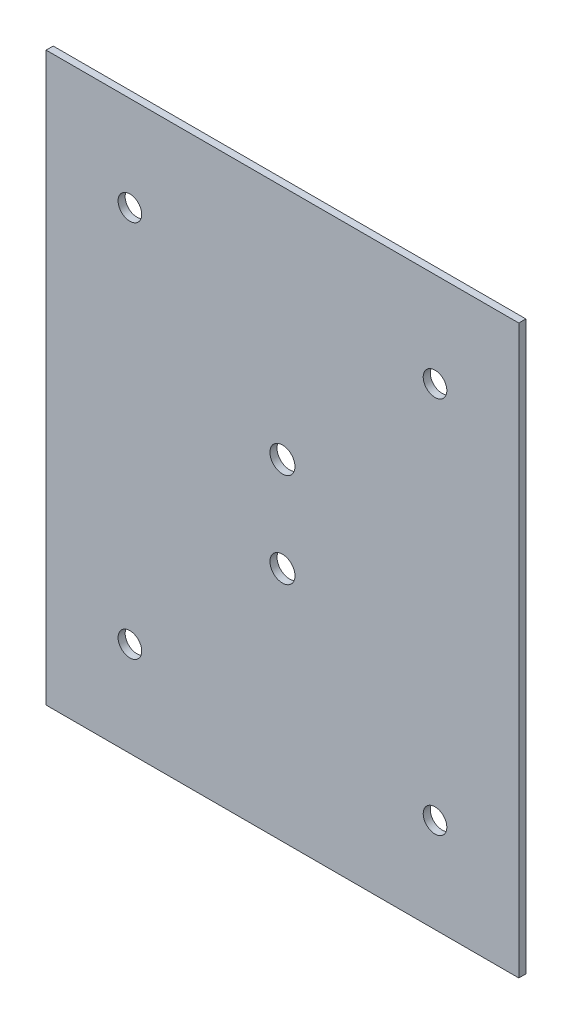
ISO-10303-21;
HEADER;
FILE_DESCRIPTION(('STEP AP214'),'2;1');
FILE_NAME('part.step','',(''),(''),'','','');
FILE_SCHEMA(('AUTOMOTIVE_DESIGN { 1 0 10303 214 1 1 1 1 }'));
ENDSEC;
DATA;
#1=APPLICATION_CONTEXT('core data for automotive mechanical design processes');
#2=APPLICATION_PROTOCOL_DEFINITION('international standard','automotive_design',2000,#1);
#3=PRODUCT_CONTEXT('',#1,'mechanical');
#4=PRODUCT('Part','Part','',(#3));
#5=PRODUCT_RELATED_PRODUCT_CATEGORY('part','',(#4));
#6=PRODUCT_DEFINITION_FORMATION('','',#4);
#7=PRODUCT_DEFINITION_CONTEXT('part definition',#1,'design');
#8=PRODUCT_DEFINITION('design','',#6,#7);
#9=PRODUCT_DEFINITION_SHAPE('','',#8);
#10=(LENGTH_UNIT() NAMED_UNIT(*) SI_UNIT(.MILLI.,.METRE.));
#11=(NAMED_UNIT(*) PLANE_ANGLE_UNIT() SI_UNIT($,.RADIAN.));
#12=(NAMED_UNIT(*) SI_UNIT($,.STERADIAN.) SOLID_ANGLE_UNIT());
#13=UNCERTAINTY_MEASURE_WITH_UNIT(LENGTH_MEASURE(1.E-05),#10,'distance_accuracy_value','');
#14=(GEOMETRIC_REPRESENTATION_CONTEXT(3) GLOBAL_UNCERTAINTY_ASSIGNED_CONTEXT((#13)) GLOBAL_UNIT_ASSIGNED_CONTEXT((#10,
#11,#12)) REPRESENTATION_CONTEXT('',''));
#15=CARTESIAN_POINT('',(0.,0.,0.));
#16=DIRECTION('',(0.,0.,1.));
#17=DIRECTION('',(1.,0.,0.));
#18=AXIS2_PLACEMENT_3D('',#15,#16,#17);
#19=CARTESIAN_POINT('',(0.,0.,1.5));
#20=DIRECTION('',(1.,0.,0.));
#21=DIRECTION('',(0.,0.,-1.));
#22=AXIS2_PLACEMENT_3D('',#19,#20,#21);
#23=PLANE('',#22);
#24=DIRECTION('',(0.,-1.,0.));
#25=VECTOR('',#24,1.);
#26=CARTESIAN_POINT('',(0.,0.,0.));
#27=LINE('',#26,#25);
#28=CARTESIAN_POINT('',(0.,120.,0.));
#29=VERTEX_POINT('',#28);
#30=CARTESIAN_POINT('',(0.,0.,0.));
#31=VERTEX_POINT('',#30);
#32=EDGE_CURVE('E98',#29,#31,#27,.T.);
#33=ORIENTED_EDGE('',*,*,#32,.T.);
#34=DIRECTION('',(0.,0.,-1.));
#35=VECTOR('',#34,1.);
#36=CARTESIAN_POINT('',(0.,0.,1.5));
#37=LINE('',#36,#35);
#38=CARTESIAN_POINT('',(0.,0.,1.5));
#39=VERTEX_POINT('',#38);
#40=EDGE_CURVE('E11',#39,#31,#37,.T.);
#41=ORIENTED_EDGE('',*,*,#40,.F.);
#42=DIRECTION('',(0.,-1.,0.));
#43=VECTOR('',#42,1.);
#44=CARTESIAN_POINT('',(0.,0.,1.5));
#45=LINE('',#44,#43);
#46=CARTESIAN_POINT('',(0.,120.,1.5));
#47=VERTEX_POINT('',#46);
#48=EDGE_CURVE('E86',#47,#39,#45,.T.);
#49=ORIENTED_EDGE('',*,*,#48,.F.);
#50=DIRECTION('',(0.,0.,-1.));
#51=VECTOR('',#50,1.);
#52=CARTESIAN_POINT('',(0.,120.,1.5));
#53=LINE('',#52,#51);
#54=EDGE_CURVE('E94',#47,#29,#53,.T.);
#55=ORIENTED_EDGE('',*,*,#54,.T.);
#56=EDGE_LOOP('',(#33,#41,#49,#55));
#57=FACE_BOUND('',#56,.T.);
#58=ADVANCED_FACE('F35',(#57),#23,.F.);
#59=CARTESIAN_POINT('',(0.,0.,1.5));
#60=DIRECTION('',(0.,1.,0.));
#61=DIRECTION('',(0.,0.,1.));
#62=AXIS2_PLACEMENT_3D('',#59,#60,#61);
#63=PLANE('',#62);
#64=DIRECTION('',(1.,0.,0.));
#65=VECTOR('',#64,1.);
#66=CARTESIAN_POINT('',(0.,0.,0.));
#67=LINE('',#66,#65);
#68=CARTESIAN_POINT('',(100.,0.,0.));
#69=VERTEX_POINT('',#68);
#70=EDGE_CURVE('E90',#31,#69,#67,.T.);
#71=ORIENTED_EDGE('',*,*,#70,.T.);
#72=DIRECTION('',(0.,0.,-1.));
#73=VECTOR('',#72,1.);
#74=CARTESIAN_POINT('',(100.,0.,1.5));
#75=LINE('',#74,#73);
#76=CARTESIAN_POINT('',(100.,0.,1.5));
#77=VERTEX_POINT('',#76);
#78=EDGE_CURVE('E43',#77,#69,#75,.T.);
#79=ORIENTED_EDGE('',*,*,#78,.F.);
#80=DIRECTION('',(1.,0.,0.));
#81=VECTOR('',#80,1.);
#82=CARTESIAN_POINT('',(0.,0.,1.5));
#83=LINE('',#82,#81);
#84=EDGE_CURVE('E81',#39,#77,#83,.T.);
#85=ORIENTED_EDGE('',*,*,#84,.F.);
#86=ORIENTED_EDGE('',*,*,#40,.T.);
#87=EDGE_LOOP('',(#71,#79,#85,#86));
#88=FACE_BOUND('',#87,.T.);
#89=ADVANCED_FACE('F89',(#88),#63,.F.);
#90=CARTESIAN_POINT('',(100.,0.,1.5));
#91=DIRECTION('',(-1.,0.,0.));
#92=DIRECTION('',(0.,0.,1.));
#93=AXIS2_PLACEMENT_3D('',#90,#91,#92);
#94=PLANE('',#93);
#95=DIRECTION('',(0.,1.,0.));
#96=VECTOR('',#95,1.);
#97=CARTESIAN_POINT('',(100.,0.,0.));
#98=LINE('',#97,#96);
#99=CARTESIAN_POINT('',(100.,120.,0.));
#100=VERTEX_POINT('',#99);
#101=EDGE_CURVE('E68',#69,#100,#98,.T.);
#102=ORIENTED_EDGE('',*,*,#101,.T.);
#103=DIRECTION('',(0.,0.,-1.));
#104=VECTOR('',#103,1.);
#105=CARTESIAN_POINT('',(100.,120.,1.5));
#106=LINE('',#105,#104);
#107=CARTESIAN_POINT('',(100.,120.,1.5));
#108=VERTEX_POINT('',#107);
#109=EDGE_CURVE('E91',#108,#100,#106,.T.);
#110=ORIENTED_EDGE('',*,*,#109,.F.);
#111=DIRECTION('',(0.,1.,0.));
#112=VECTOR('',#111,1.);
#113=CARTESIAN_POINT('',(100.,0.,1.5));
#114=LINE('',#113,#112);
#115=EDGE_CURVE('E84',#77,#108,#114,.T.);
#116=ORIENTED_EDGE('',*,*,#115,.F.);
#117=ORIENTED_EDGE('',*,*,#78,.T.);
#118=EDGE_LOOP('',(#102,#110,#116,#117));
#119=FACE_BOUND('',#118,.T.);
#120=ADVANCED_FACE('F92',(#119),#94,.F.);
#121=CARTESIAN_POINT('',(0.,120.,1.5));
#122=DIRECTION('',(0.,-1.,0.));
#123=DIRECTION('',(0.,0.,-1.));
#124=AXIS2_PLACEMENT_3D('',#121,#122,#123);
#125=PLANE('',#124);
#126=DIRECTION('',(-1.,0.,0.));
#127=VECTOR('',#126,1.);
#128=CARTESIAN_POINT('',(0.,120.,0.));
#129=LINE('',#128,#127);
#130=EDGE_CURVE('E74',#100,#29,#129,.T.);
#131=ORIENTED_EDGE('',*,*,#130,.T.);
#132=ORIENTED_EDGE('',*,*,#54,.F.);
#133=DIRECTION('',(-1.,0.,0.));
#134=VECTOR('',#133,1.);
#135=CARTESIAN_POINT('',(0.,120.,1.5));
#136=LINE('',#135,#134);
#137=EDGE_CURVE('E51',#108,#47,#136,.T.);
#138=ORIENTED_EDGE('',*,*,#137,.F.);
#139=ORIENTED_EDGE('',*,*,#109,.T.);
#140=EDGE_LOOP('',(#131,#132,#138,#139));
#141=FACE_BOUND('',#140,.T.);
#142=ADVANCED_FACE('F106',(#141),#125,.F.);
#143=CARTESIAN_POINT('',(0.,0.,1.5));
#144=DIRECTION('',(0.,0.,-1.));
#145=DIRECTION('',(-1.,0.,0.));
#146=AXIS2_PLACEMENT_3D('',#143,#144,#145);
#147=PLANE('',#146);
#148=CARTESIAN_POINT('',(50.,70.,1.5));
#149=DIRECTION('',(0.,0.,1.));
#150=DIRECTION('',(1.,0.,0.));
#151=AXIS2_PLACEMENT_3D('',#148,#149,#150);
#152=CIRCLE('',#151,2.65);
#153=CARTESIAN_POINT('',(52.65,70.,1.5));
#154=VERTEX_POINT('',#153);
#155=EDGE_CURVE('E144',#154,#154,#152,.T.);
#156=ORIENTED_EDGE('',*,*,#155,.F.);
#157=EDGE_LOOP('',(#156));
#158=FACE_BOUND('',#157,.T.);
#159=CARTESIAN_POINT('',(50.,50.,1.5));
#160=DIRECTION('',(0.,0.,1.));
#161=DIRECTION('',(1.,0.,0.));
#162=AXIS2_PLACEMENT_3D('',#159,#160,#161);
#163=CIRCLE('',#162,2.65);
#164=CARTESIAN_POINT('',(52.65,50.,1.5));
#165=VERTEX_POINT('',#164);
#166=EDGE_CURVE('E138',#165,#165,#163,.T.);
#167=ORIENTED_EDGE('',*,*,#166,.F.);
#168=EDGE_LOOP('',(#167));
#169=FACE_BOUND('',#168,.T.);
#170=CARTESIAN_POINT('',(82.2750000000004,99.999999999999,1.5));
#171=DIRECTION('',(0.,0.,-1.));
#172=DIRECTION('',(-1.,0.,0.));
#173=AXIS2_PLACEMENT_3D('',#170,#171,#172);
#174=CIRCLE('',#173,2.5);
#175=CARTESIAN_POINT('',(79.7750000000004,99.999999999999,1.5));
#176=VERTEX_POINT('',#175);
#177=EDGE_CURVE('E127',#176,#176,#174,.T.);
#178=ORIENTED_EDGE('',*,*,#177,.T.);
#179=EDGE_LOOP('',(#178));
#180=FACE_BOUND('',#179,.T.);
#181=CARTESIAN_POINT('',(17.7249999999996,99.9999999999987,1.5));
#182=DIRECTION('',(0.,0.,-1.));
#183=DIRECTION('',(-1.,0.,0.));
#184=AXIS2_PLACEMENT_3D('',#181,#182,#183);
#185=CIRCLE('',#184,2.5);
#186=CARTESIAN_POINT('',(15.2249999999996,99.9999999999987,1.5));
#187=VERTEX_POINT('',#186);
#188=EDGE_CURVE('E121',#187,#187,#185,.T.);
#189=ORIENTED_EDGE('',*,*,#188,.T.);
#190=EDGE_LOOP('',(#189));
#191=FACE_BOUND('',#190,.T.);
#192=CARTESIAN_POINT('',(17.7249999999996,20.000000000001,1.5));
#193=DIRECTION('',(0.,0.,-1.));
#194=DIRECTION('',(-1.,0.,0.));
#195=AXIS2_PLACEMENT_3D('',#192,#193,#194);
#196=CIRCLE('',#195,2.49999999999931);
#197=CARTESIAN_POINT('',(15.2250000000003,20.000000000001,1.5));
#198=VERTEX_POINT('',#197);
#199=EDGE_CURVE('E115',#198,#198,#196,.T.);
#200=ORIENTED_EDGE('',*,*,#199,.T.);
#201=EDGE_LOOP('',(#200));
#202=FACE_BOUND('',#201,.T.);
#203=CARTESIAN_POINT('',(82.2750000000004,20.000000000001,1.5));
#204=DIRECTION('',(0.,0.,-1.));
#205=DIRECTION('',(-1.,0.,0.));
#206=AXIS2_PLACEMENT_3D('',#203,#204,#205);
#207=CIRCLE('',#206,2.49999999999932);
#208=CARTESIAN_POINT('',(79.7750000000011,20.000000000001,1.5));
#209=VERTEX_POINT('',#208);
#210=EDGE_CURVE('E101',#209,#209,#207,.T.);
#211=ORIENTED_EDGE('',*,*,#210,.T.);
#212=EDGE_LOOP('',(#211));
#213=FACE_BOUND('',#212,.T.);
#214=ORIENTED_EDGE('',*,*,#48,.T.);
#215=ORIENTED_EDGE('',*,*,#84,.T.);
#216=ORIENTED_EDGE('',*,*,#115,.T.);
#217=ORIENTED_EDGE('',*,*,#137,.T.);
#218=EDGE_LOOP('',(#214,#215,#216,#217));
#219=FACE_BOUND('',#218,.T.);
#220=ADVANCED_FACE('F82',(#158,#169,#180,#191,#202,#213,#219),#147,.F.);
#221=CARTESIAN_POINT('',(0.,0.,0.));
#222=DIRECTION('',(0.,0.,-1.));
#223=DIRECTION('',(-1.,0.,0.));
#224=AXIS2_PLACEMENT_3D('',#221,#222,#223);
#225=PLANE('',#224);
#226=CARTESIAN_POINT('',(50.,70.,0.));
#227=DIRECTION('',(0.,0.,-1.));
#228=DIRECTION('',(-1.,0.,0.));
#229=AXIS2_PLACEMENT_3D('',#226,#227,#228);
#230=CIRCLE('',#229,2.65);
#231=CARTESIAN_POINT('',(47.35,70.,0.));
#232=VERTEX_POINT('',#231);
#233=EDGE_CURVE('E141',#232,#232,#230,.F.);
#234=ORIENTED_EDGE('',*,*,#233,.T.);
#235=EDGE_LOOP('',(#234));
#236=FACE_BOUND('',#235,.T.);
#237=CARTESIAN_POINT('',(50.,50.,0.));
#238=DIRECTION('',(0.,0.,-1.));
#239=DIRECTION('',(-1.,0.,0.));
#240=AXIS2_PLACEMENT_3D('',#237,#238,#239);
#241=CIRCLE('',#240,2.65);
#242=CARTESIAN_POINT('',(47.35,50.,0.));
#243=VERTEX_POINT('',#242);
#244=EDGE_CURVE('E133',#243,#243,#241,.F.);
#245=ORIENTED_EDGE('',*,*,#244,.T.);
#246=EDGE_LOOP('',(#245));
#247=FACE_BOUND('',#246,.T.);
#248=CARTESIAN_POINT('',(82.2750000000004,99.999999999999,0.));
#249=DIRECTION('',(0.,0.,-1.));
#250=DIRECTION('',(-1.,0.,0.));
#251=AXIS2_PLACEMENT_3D('',#248,#249,#250);
#252=CIRCLE('',#251,2.5);
#253=CARTESIAN_POINT('',(79.7750000000004,99.999999999999,0.));
#254=VERTEX_POINT('',#253);
#255=EDGE_CURVE('E130',#254,#254,#252,.T.);
#256=ORIENTED_EDGE('',*,*,#255,.F.);
#257=EDGE_LOOP('',(#256));
#258=FACE_BOUND('',#257,.T.);
#259=CARTESIAN_POINT('',(17.7249999999996,99.9999999999987,0.));
#260=DIRECTION('',(0.,0.,-1.));
#261=DIRECTION('',(-1.,0.,0.));
#262=AXIS2_PLACEMENT_3D('',#259,#260,#261);
#263=CIRCLE('',#262,2.5);
#264=CARTESIAN_POINT('',(15.2249999999996,99.9999999999987,0.));
#265=VERTEX_POINT('',#264);
#266=EDGE_CURVE('E124',#265,#265,#263,.T.);
#267=ORIENTED_EDGE('',*,*,#266,.F.);
#268=EDGE_LOOP('',(#267));
#269=FACE_BOUND('',#268,.T.);
#270=CARTESIAN_POINT('',(17.7249999999996,20.000000000001,0.));
#271=DIRECTION('',(0.,0.,-1.));
#272=DIRECTION('',(-1.,0.,0.));
#273=AXIS2_PLACEMENT_3D('',#270,#271,#272);
#274=CIRCLE('',#273,2.49999999999931);
#275=CARTESIAN_POINT('',(15.2250000000003,20.000000000001,0.));
#276=VERTEX_POINT('',#275);
#277=EDGE_CURVE('E118',#276,#276,#274,.T.);
#278=ORIENTED_EDGE('',*,*,#277,.F.);
#279=EDGE_LOOP('',(#278));
#280=FACE_BOUND('',#279,.T.);
#281=CARTESIAN_POINT('',(82.2750000000004,20.000000000001,0.));
#282=DIRECTION('',(0.,0.,-1.));
#283=DIRECTION('',(-1.,0.,0.));
#284=AXIS2_PLACEMENT_3D('',#281,#282,#283);
#285=CIRCLE('',#284,2.49999999999932);
#286=CARTESIAN_POINT('',(79.7750000000011,20.000000000001,0.));
#287=VERTEX_POINT('',#286);
#288=EDGE_CURVE('E112',#287,#287,#285,.T.);
#289=ORIENTED_EDGE('',*,*,#288,.F.);
#290=EDGE_LOOP('',(#289));
#291=FACE_BOUND('',#290,.T.);
#292=ORIENTED_EDGE('',*,*,#32,.F.);
#293=ORIENTED_EDGE('',*,*,#130,.F.);
#294=ORIENTED_EDGE('',*,*,#101,.F.);
#295=ORIENTED_EDGE('',*,*,#70,.F.);
#296=EDGE_LOOP('',(#292,#293,#294,#295));
#297=FACE_BOUND('',#296,.T.);
#298=ADVANCED_FACE('F109',(#236,#247,#258,#269,#280,#291,#297),#225,.T.);
#299=CARTESIAN_POINT('',(82.2750000000004,20.000000000001,1.5));
#300=DIRECTION('',(0.,0.,-1.));
#301=DIRECTION('',(-1.,0.,0.));
#302=AXIS2_PLACEMENT_3D('',#299,#300,#301);
#303=CYLINDRICAL_SURFACE('',#302,2.49999999999932);
#304=ORIENTED_EDGE('',*,*,#210,.F.);
#305=EDGE_LOOP('',(#304));
#306=FACE_BOUND('',#305,.T.);
#307=ORIENTED_EDGE('',*,*,#288,.T.);
#308=EDGE_LOOP('',(#307));
#309=FACE_BOUND('',#308,.T.);
#310=ADVANCED_FACE('F164',(#306,#309),#303,.F.);
#311=CARTESIAN_POINT('',(17.7249999999996,20.000000000001,1.5));
#312=DIRECTION('',(0.,0.,-1.));
#313=DIRECTION('',(-1.,0.,0.));
#314=AXIS2_PLACEMENT_3D('',#311,#312,#313);
#315=CYLINDRICAL_SURFACE('',#314,2.49999999999931);
#316=ORIENTED_EDGE('',*,*,#199,.F.);
#317=EDGE_LOOP('',(#316));
#318=FACE_BOUND('',#317,.T.);
#319=ORIENTED_EDGE('',*,*,#277,.T.);
#320=EDGE_LOOP('',(#319));
#321=FACE_BOUND('',#320,.T.);
#322=ADVANCED_FACE('F167',(#318,#321),#315,.F.);
#323=CARTESIAN_POINT('',(17.7249999999996,99.9999999999987,1.5));
#324=DIRECTION('',(0.,0.,-1.));
#325=DIRECTION('',(-1.,0.,0.));
#326=AXIS2_PLACEMENT_3D('',#323,#324,#325);
#327=CYLINDRICAL_SURFACE('',#326,2.5);
#328=ORIENTED_EDGE('',*,*,#188,.F.);
#329=EDGE_LOOP('',(#328));
#330=FACE_BOUND('',#329,.T.);
#331=ORIENTED_EDGE('',*,*,#266,.T.);
#332=EDGE_LOOP('',(#331));
#333=FACE_BOUND('',#332,.T.);
#334=ADVANCED_FACE('F213',(#330,#333),#327,.F.);
#335=CARTESIAN_POINT('',(82.2750000000004,99.999999999999,1.5));
#336=DIRECTION('',(0.,0.,-1.));
#337=DIRECTION('',(-1.,0.,0.));
#338=AXIS2_PLACEMENT_3D('',#335,#336,#337);
#339=CYLINDRICAL_SURFACE('',#338,2.5);
#340=ORIENTED_EDGE('',*,*,#177,.F.);
#341=EDGE_LOOP('',(#340));
#342=FACE_BOUND('',#341,.T.);
#343=ORIENTED_EDGE('',*,*,#255,.T.);
#344=EDGE_LOOP('',(#343));
#345=FACE_BOUND('',#344,.T.);
#346=ADVANCED_FACE('F221',(#342,#345),#339,.F.);
#347=CARTESIAN_POINT('',(50.,50.,-7.4953318805774));
#348=DIRECTION('',(0.,0.,1.));
#349=DIRECTION('',(1.,0.,0.));
#350=AXIS2_PLACEMENT_3D('',#347,#348,#349);
#351=CYLINDRICAL_SURFACE('',#350,2.65);
#352=ORIENTED_EDGE('',*,*,#166,.T.);
#353=EDGE_LOOP('',(#352));
#354=FACE_BOUND('',#353,.T.);
#355=ORIENTED_EDGE('',*,*,#244,.F.);
#356=EDGE_LOOP('',(#355));
#357=FACE_BOUND('',#356,.T.);
#358=ADVANCED_FACE('F228',(#354,#357),#351,.F.);
#359=CARTESIAN_POINT('',(50.,70.,-7.4953318805774));
#360=DIRECTION('',(0.,0.,1.));
#361=DIRECTION('',(1.,0.,0.));
#362=AXIS2_PLACEMENT_3D('',#359,#360,#361);
#363=CYLINDRICAL_SURFACE('',#362,2.65);
#364=ORIENTED_EDGE('',*,*,#155,.T.);
#365=EDGE_LOOP('',(#364));
#366=FACE_BOUND('',#365,.T.);
#367=ORIENTED_EDGE('',*,*,#233,.F.);
#368=EDGE_LOOP('',(#367));
#369=FACE_BOUND('',#368,.T.);
#370=ADVANCED_FACE('F148',(#366,#369),#363,.F.);
#371=CLOSED_SHELL('',(#58,#89,#120,#142,#220,#298,#310,#322,#334,#346,#358,#370));
#372=MANIFOLD_SOLID_BREP('B2',#371);
#373=ADVANCED_BREP_SHAPE_REPRESENTATION('',(#18,#372),#14);
#374=SHAPE_DEFINITION_REPRESENTATION(#9,#373);
ENDSEC;
END-ISO-10303-21;
